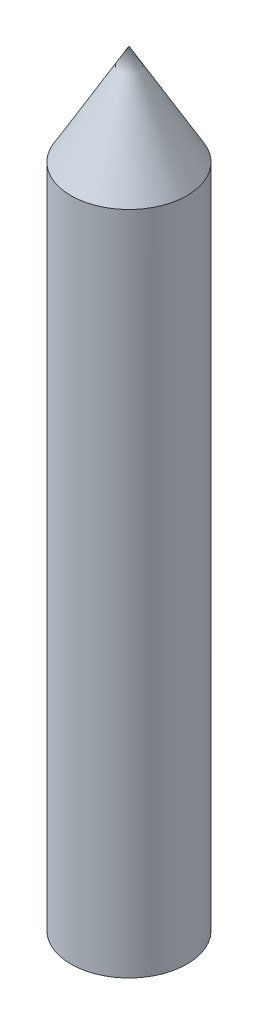
ISO-10303-21;
HEADER;
FILE_DESCRIPTION(('STEP AP214'),'2;1');
FILE_NAME('part.step','',(''),(''),'','','');
FILE_SCHEMA(('AUTOMOTIVE_DESIGN { 1 0 10303 214 1 1 1 1 }'));
ENDSEC;
DATA;
#1=APPLICATION_CONTEXT('core data for automotive mechanical design processes');
#2=APPLICATION_PROTOCOL_DEFINITION('international standard','automotive_design',2000,#1);
#3=PRODUCT_CONTEXT('',#1,'mechanical');
#4=PRODUCT('Part','Part','',(#3));
#5=PRODUCT_RELATED_PRODUCT_CATEGORY('part','',(#4));
#6=PRODUCT_DEFINITION_FORMATION('','',#4);
#7=PRODUCT_DEFINITION_CONTEXT('part definition',#1,'design');
#8=PRODUCT_DEFINITION('design','',#6,#7);
#9=PRODUCT_DEFINITION_SHAPE('','',#8);
#10=(LENGTH_UNIT() NAMED_UNIT(*) SI_UNIT(.MILLI.,.METRE.));
#11=(NAMED_UNIT(*) PLANE_ANGLE_UNIT() SI_UNIT($,.RADIAN.));
#12=(NAMED_UNIT(*) SI_UNIT($,.STERADIAN.) SOLID_ANGLE_UNIT());
#13=UNCERTAINTY_MEASURE_WITH_UNIT(LENGTH_MEASURE(1.E-05),#10,'distance_accuracy_value','');
#14=(GEOMETRIC_REPRESENTATION_CONTEXT(3) GLOBAL_UNCERTAINTY_ASSIGNED_CONTEXT((#13)) GLOBAL_UNIT_ASSIGNED_CONTEXT((#10,
#11,#12)) REPRESENTATION_CONTEXT('',''));
#15=CARTESIAN_POINT('',(0.,0.,0.));
#16=DIRECTION('',(0.,0.,1.));
#17=DIRECTION('',(1.,0.,0.));
#18=AXIS2_PLACEMENT_3D('',#15,#16,#17);
#19=CARTESIAN_POINT('',(2.425,0.,0.));
#20=DIRECTION('',(0.,1.,0.));
#21=DIRECTION('',(0.,0.,1.));
#22=AXIS2_PLACEMENT_3D('',#19,#20,#21);
#23=PLANE('',#22);
#24=CARTESIAN_POINT('',(0.,0.,0.));
#25=DIRECTION('',(0.,1.,0.));
#26=DIRECTION('',(0.,0.,1.));
#27=AXIS2_PLACEMENT_3D('',#24,#25,#26);
#28=CIRCLE('',#27,2.425);
#29=CARTESIAN_POINT('',(0.,0.,2.425));
#30=VERTEX_POINT('',#29);
#31=EDGE_CURVE('E52',#30,#30,#28,.T.);
#32=ORIENTED_EDGE('',*,*,#31,.F.);
#33=EDGE_LOOP('',(#32));
#34=FACE_BOUND('',#33,.T.);
#35=ADVANCED_FACE('F45',(#34),#23,.F.);
#36=CARTESIAN_POINT('',(0.,27.7997767916454,0.));
#37=DIRECTION('',(0.,-1.,0.));
#38=DIRECTION('',(0.,0.,-1.));
#39=AXIS2_PLACEMENT_3D('',#36,#37,#38);
#40=CONICAL_SURFACE('',#39,2.425,0.523598775598293);
#41=CARTESIAN_POINT('',(0.,32.,0.));
#42=VERTEX_POINT('',#41);
#43=VERTEX_LOOP('',#42);
#44=FACE_BOUND('',#43,.T.);
#45=CARTESIAN_POINT('',(0.,27.7997767916454,0.));
#46=DIRECTION('',(0.,1.,0.));
#47=DIRECTION('',(0.,0.,1.));
#48=AXIS2_PLACEMENT_3D('',#45,#46,#47);
#49=CIRCLE('',#48,2.425);
#50=CARTESIAN_POINT('',(0.,27.7997767916454,2.425));
#51=VERTEX_POINT('',#50);
#52=EDGE_CURVE('E11',#51,#51,#49,.T.);
#53=ORIENTED_EDGE('',*,*,#52,.T.);
#54=EDGE_LOOP('',(#53));
#55=FACE_BOUND('',#54,.T.);
#56=ADVANCED_FACE('F55',(#44,#55),#40,.T.);
#57=CARTESIAN_POINT('',(0.,0.,0.));
#58=DIRECTION('',(0.,1.,0.));
#59=DIRECTION('',(0.,0.,1.));
#60=AXIS2_PLACEMENT_3D('',#57,#58,#59);
#61=CYLINDRICAL_SURFACE('',#60,2.425);
#62=ORIENTED_EDGE('',*,*,#52,.F.);
#63=EDGE_LOOP('',(#62));
#64=FACE_BOUND('',#63,.T.);
#65=ORIENTED_EDGE('',*,*,#31,.T.);
#66=EDGE_LOOP('',(#65));
#67=FACE_BOUND('',#66,.T.);
#68=ADVANCED_FACE('F58',(#64,#67),#61,.T.);
#69=CLOSED_SHELL('',(#35,#56,#68));
#70=MANIFOLD_SOLID_BREP('B2',#69);
#71=ADVANCED_BREP_SHAPE_REPRESENTATION('',(#18,#70),#14);
#72=SHAPE_DEFINITION_REPRESENTATION(#9,#71);
ENDSEC;
END-ISO-10303-21;
